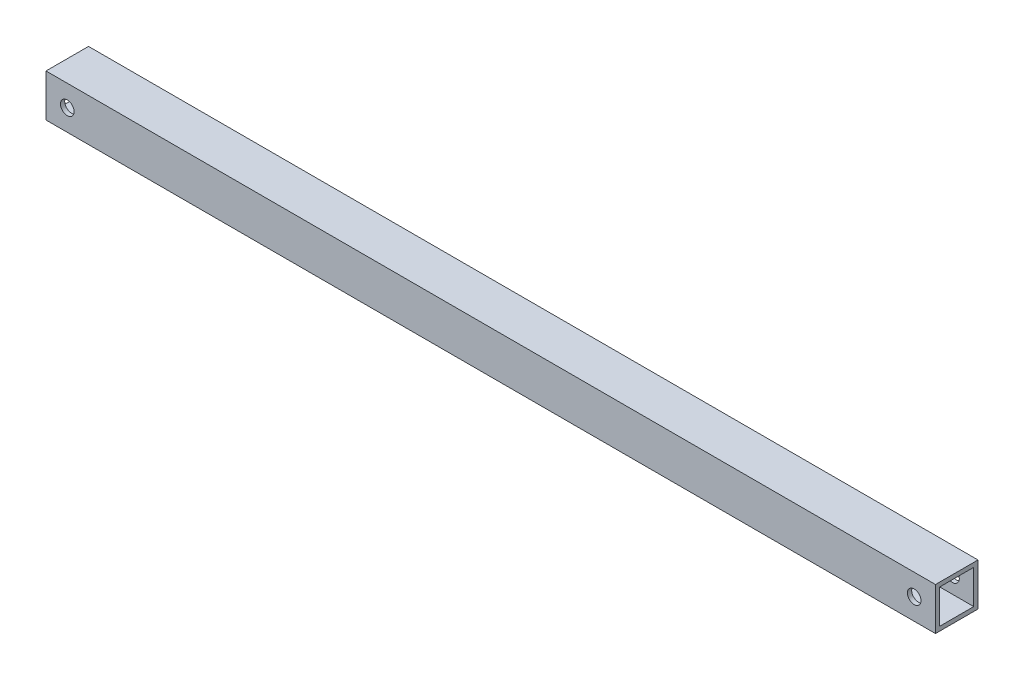
ISO-10303-21;
HEADER;
FILE_DESCRIPTION(('STEP AP214'),'2;1');
FILE_NAME('part.step','',(''),(''),'','','');
FILE_SCHEMA(('AUTOMOTIVE_DESIGN { 1 0 10303 214 1 1 1 1 }'));
ENDSEC;
DATA;
#1=APPLICATION_CONTEXT('core data for automotive mechanical design processes');
#2=APPLICATION_PROTOCOL_DEFINITION('international standard','automotive_design',2000,#1);
#3=PRODUCT_CONTEXT('',#1,'mechanical');
#4=PRODUCT('Part','Part','',(#3));
#5=PRODUCT_RELATED_PRODUCT_CATEGORY('part','',(#4));
#6=PRODUCT_DEFINITION_FORMATION('','',#4);
#7=PRODUCT_DEFINITION_CONTEXT('part definition',#1,'design');
#8=PRODUCT_DEFINITION('design','',#6,#7);
#9=PRODUCT_DEFINITION_SHAPE('','',#8);
#10=(LENGTH_UNIT() NAMED_UNIT(*) SI_UNIT(.MILLI.,.METRE.));
#11=(NAMED_UNIT(*) PLANE_ANGLE_UNIT() SI_UNIT($,.RADIAN.));
#12=(NAMED_UNIT(*) SI_UNIT($,.STERADIAN.) SOLID_ANGLE_UNIT());
#13=UNCERTAINTY_MEASURE_WITH_UNIT(LENGTH_MEASURE(1.E-05),#10,'distance_accuracy_value','');
#14=(GEOMETRIC_REPRESENTATION_CONTEXT(3) GLOBAL_UNCERTAINTY_ASSIGNED_CONTEXT((#13)) GLOBAL_UNIT_ASSIGNED_CONTEXT((#10,
#11,#12)) REPRESENTATION_CONTEXT('',''));
#15=CARTESIAN_POINT('',(0.,0.,0.));
#16=DIRECTION('',(0.,0.,1.));
#17=DIRECTION('',(1.,0.,0.));
#18=AXIS2_PLACEMENT_3D('',#15,#16,#17);
#19=CARTESIAN_POINT('',(-368.108891324554,245.000000000002,10.));
#20=DIRECTION('',(0.,0.,-1.));
#21=DIRECTION('',(-1.,0.,0.));
#22=AXIS2_PLACEMENT_3D('',#19,#20,#21);
#23=CYLINDRICAL_SURFACE('',#22,1.59999999999996);
#24=CARTESIAN_POINT('',(-368.108891324554,245.000000000002,0.999999999999999));
#25=DIRECTION('',(0.,0.,-1.));
#26=DIRECTION('',(-1.,0.,0.));
#27=AXIS2_PLACEMENT_3D('',#24,#25,#26);
#28=CIRCLE('',#27,1.59999999999996);
#29=CARTESIAN_POINT('',(-369.708891324554,245.000000000002,0.999999999999999));
#30=VERTEX_POINT('',#29);
#31=EDGE_CURVE('E139',#30,#30,#28,.T.);
#32=ORIENTED_EDGE('',*,*,#31,.F.);
#33=EDGE_LOOP('',(#32));
#34=FACE_BOUND('',#33,.T.);
#35=CARTESIAN_POINT('',(-368.108891324554,245.000000000002,0.));
#36=DIRECTION('',(0.,0.,1.));
#37=DIRECTION('',(1.,0.,0.));
#38=AXIS2_PLACEMENT_3D('',#35,#36,#37);
#39=CIRCLE('',#38,1.59999999999996);
#40=CARTESIAN_POINT('',(-366.508891324554,245.000000000002,0.));
#41=VERTEX_POINT('',#40);
#42=EDGE_CURVE('E146',#41,#41,#39,.T.);
#43=ORIENTED_EDGE('',*,*,#42,.F.);
#44=EDGE_LOOP('',(#43));
#45=FACE_BOUND('',#44,.T.);
#46=ADVANCED_FACE('F33',(#34,#45),#23,.F.);
#47=CARTESIAN_POINT('',(-567.294734199927,244.999999997917,10.));
#48=DIRECTION('',(0.,0.,-1.));
#49=DIRECTION('',(-1.,0.,0.));
#50=AXIS2_PLACEMENT_3D('',#47,#48,#49);
#51=CYLINDRICAL_SURFACE('',#50,1.60000000000002);
#52=CARTESIAN_POINT('',(-567.294734199927,244.999999997917,0.999999999999999));
#53=DIRECTION('',(0.,0.,-1.));
#54=DIRECTION('',(-1.,0.,0.));
#55=AXIS2_PLACEMENT_3D('',#52,#53,#54);
#56=CIRCLE('',#55,1.60000000000002);
#57=CARTESIAN_POINT('',(-568.894734199927,244.999999997917,0.999999999999999));
#58=VERTEX_POINT('',#57);
#59=EDGE_CURVE('E37',#58,#58,#56,.T.);
#60=ORIENTED_EDGE('',*,*,#59,.F.);
#61=EDGE_LOOP('',(#60));
#62=FACE_BOUND('',#61,.T.);
#63=CARTESIAN_POINT('',(-567.294734199927,244.999999997917,0.));
#64=DIRECTION('',(0.,0.,1.));
#65=DIRECTION('',(1.,0.,0.));
#66=AXIS2_PLACEMENT_3D('',#63,#64,#65);
#67=CIRCLE('',#66,1.60000000000002);
#68=CARTESIAN_POINT('',(-565.694734199927,244.999999997917,0.));
#69=VERTEX_POINT('',#68);
#70=EDGE_CURVE('E142',#69,#69,#67,.T.);
#71=ORIENTED_EDGE('',*,*,#70,.F.);
#72=EDGE_LOOP('',(#71));
#73=FACE_BOUND('',#72,.T.);
#74=ADVANCED_FACE('F189',(#62,#73),#51,.F.);
#75=CARTESIAN_POINT('',(0.,0.,10.));
#76=DIRECTION('',(0.,0.,1.));
#77=DIRECTION('',(1.,0.,0.));
#78=AXIS2_PLACEMENT_3D('',#75,#76,#77);
#79=PLANE('',#78);
#80=CARTESIAN_POINT('',(-368.108891324554,245.000000000002,10.));
#81=DIRECTION('',(0.,0.,1.));
#82=DIRECTION('',(1.,0.,0.));
#83=AXIS2_PLACEMENT_3D('',#80,#81,#82);
#84=CIRCLE('',#83,1.59999999999996);
#85=CARTESIAN_POINT('',(-366.508891324554,245.000000000002,10.));
#86=VERTEX_POINT('',#85);
#87=EDGE_CURVE('E149',#86,#86,#84,.T.);
#88=ORIENTED_EDGE('',*,*,#87,.F.);
#89=EDGE_LOOP('',(#88));
#90=FACE_BOUND('',#89,.T.);
#91=DIRECTION('',(0.,1.,0.));
#92=VECTOR('',#91,1.);
#93=CARTESIAN_POINT('',(-363.108891324554,240.000000000002,10.));
#94=LINE('',#93,#92);
#95=CARTESIAN_POINT('',(-363.108891324554,240.000000000002,10.));
#96=VERTEX_POINT('',#95);
#97=CARTESIAN_POINT('',(-363.108891324554,250.000000000002,10.));
#98=VERTEX_POINT('',#97);
#99=EDGE_CURVE('E155',#96,#98,#94,.T.);
#100=ORIENTED_EDGE('',*,*,#99,.T.);
#101=DIRECTION('',(-1.,0.,0.));
#102=VECTOR('',#101,1.);
#103=CARTESIAN_POINT('',(-363.108891324554,250.000000000002,10.));
#104=LINE('',#103,#102);
#105=CARTESIAN_POINT('',(-572.29473420006,250.000000000002,10.));
#106=VERTEX_POINT('',#105);
#107=EDGE_CURVE('E158',#98,#106,#104,.T.);
#108=ORIENTED_EDGE('',*,*,#107,.T.);
#109=DIRECTION('',(0.,-1.,0.));
#110=VECTOR('',#109,1.);
#111=CARTESIAN_POINT('',(-572.29473420006,240.000000000002,10.));
#112=LINE('',#111,#110);
#113=CARTESIAN_POINT('',(-572.29473420006,240.000000000002,10.));
#114=VERTEX_POINT('',#113);
#115=EDGE_CURVE('E161',#106,#114,#112,.T.);
#116=ORIENTED_EDGE('',*,*,#115,.T.);
#117=DIRECTION('',(1.,0.,0.));
#118=VECTOR('',#117,1.);
#119=CARTESIAN_POINT('',(-363.108891324554,240.000000000002,10.));
#120=LINE('',#119,#118);
#121=EDGE_CURVE('E163',#114,#96,#120,.T.);
#122=ORIENTED_EDGE('',*,*,#121,.T.);
#123=EDGE_LOOP('',(#100,#108,#116,#122));
#124=FACE_BOUND('',#123,.T.);
#125=CARTESIAN_POINT('',(-567.294734199927,244.999999997917,10.));
#126=DIRECTION('',(0.,0.,1.));
#127=DIRECTION('',(1.,0.,0.));
#128=AXIS2_PLACEMENT_3D('',#125,#126,#127);
#129=CIRCLE('',#128,1.60000000000002);
#130=CARTESIAN_POINT('',(-565.694734199927,244.999999997917,10.));
#131=VERTEX_POINT('',#130);
#132=EDGE_CURVE('E143',#131,#131,#129,.T.);
#133=ORIENTED_EDGE('',*,*,#132,.F.);
#134=EDGE_LOOP('',(#133));
#135=FACE_BOUND('',#134,.T.);
#136=ADVANCED_FACE('F192',(#90,#124,#135),#79,.T.);
#137=CARTESIAN_POINT('',(0.,0.,0.));
#138=DIRECTION('',(0.,0.,1.));
#139=DIRECTION('',(1.,0.,0.));
#140=AXIS2_PLACEMENT_3D('',#137,#138,#139);
#141=PLANE('',#140);
#142=DIRECTION('',(0.,1.,0.));
#143=VECTOR('',#142,1.);
#144=CARTESIAN_POINT('',(-363.108891324554,240.000000000002,0.));
#145=LINE('',#144,#143);
#146=CARTESIAN_POINT('',(-363.108891324554,240.000000000002,0.));
#147=VERTEX_POINT('',#146);
#148=CARTESIAN_POINT('',(-363.108891324554,250.000000000002,0.));
#149=VERTEX_POINT('',#148);
#150=EDGE_CURVE('E152',#147,#149,#145,.T.);
#151=ORIENTED_EDGE('',*,*,#150,.F.);
#152=DIRECTION('',(1.,0.,0.));
#153=VECTOR('',#152,1.);
#154=CARTESIAN_POINT('',(-363.108891324554,240.000000000002,0.));
#155=LINE('',#154,#153);
#156=CARTESIAN_POINT('',(-572.29473420006,240.000000000002,0.));
#157=VERTEX_POINT('',#156);
#158=EDGE_CURVE('E159',#157,#147,#155,.T.);
#159=ORIENTED_EDGE('',*,*,#158,.F.);
#160=DIRECTION('',(0.,-1.,0.));
#161=VECTOR('',#160,1.);
#162=CARTESIAN_POINT('',(-572.29473420006,240.000000000002,0.));
#163=LINE('',#162,#161);
#164=CARTESIAN_POINT('',(-572.29473420006,250.000000000002,0.));
#165=VERTEX_POINT('',#164);
#166=EDGE_CURVE('E170',#165,#157,#163,.T.);
#167=ORIENTED_EDGE('',*,*,#166,.F.);
#168=DIRECTION('',(-1.,0.,0.));
#169=VECTOR('',#168,1.);
#170=CARTESIAN_POINT('',(-363.108891324554,250.000000000002,0.));
#171=LINE('',#170,#169);
#172=EDGE_CURVE('E168',#149,#165,#171,.T.);
#173=ORIENTED_EDGE('',*,*,#172,.F.);
#174=EDGE_LOOP('',(#151,#159,#167,#173));
#175=FACE_BOUND('',#174,.T.);
#176=ORIENTED_EDGE('',*,*,#42,.T.);
#177=EDGE_LOOP('',(#176));
#178=FACE_BOUND('',#177,.T.);
#179=ORIENTED_EDGE('',*,*,#70,.T.);
#180=EDGE_LOOP('',(#179));
#181=FACE_BOUND('',#180,.T.);
#182=ADVANCED_FACE('F194',(#175,#178,#181),#141,.F.);
#183=CARTESIAN_POINT('',(-363.108891324554,240.000000000002,10.));
#184=DIRECTION('',(-1.,0.,0.));
#185=DIRECTION('',(0.,0.,1.));
#186=AXIS2_PLACEMENT_3D('',#183,#184,#185);
#187=PLANE('',#186);
#188=DIRECTION('',(0.,0.,-1.));
#189=VECTOR('',#188,1.);
#190=CARTESIAN_POINT('',(-363.108891324554,249.000000000002,1.));
#191=LINE('',#190,#189);
#192=CARTESIAN_POINT('',(-363.108891324554,249.000000000002,9.));
#193=VERTEX_POINT('',#192);
#194=CARTESIAN_POINT('',(-363.108891324554,249.000000000002,1.));
#195=VERTEX_POINT('',#194);
#196=EDGE_CURVE('E108',#193,#195,#191,.T.);
#197=ORIENTED_EDGE('',*,*,#196,.T.);
#198=DIRECTION('',(0.,-1.,0.));
#199=VECTOR('',#198,1.);
#200=CARTESIAN_POINT('',(-363.108891324554,241.000000000002,1.));
#201=LINE('',#200,#199);
#202=CARTESIAN_POINT('',(-363.108891324554,241.000000000002,1.));
#203=VERTEX_POINT('',#202);
#204=EDGE_CURVE('E102',#195,#203,#201,.T.);
#205=ORIENTED_EDGE('',*,*,#204,.T.);
#206=DIRECTION('',(0.,0.,1.));
#207=VECTOR('',#206,1.);
#208=CARTESIAN_POINT('',(-363.108891324554,241.000000000002,1.));
#209=LINE('',#208,#207);
#210=CARTESIAN_POINT('',(-363.108891324554,241.000000000002,9.));
#211=VERTEX_POINT('',#210);
#212=EDGE_CURVE('E111',#203,#211,#209,.T.);
#213=ORIENTED_EDGE('',*,*,#212,.T.);
#214=DIRECTION('',(0.,1.,0.));
#215=VECTOR('',#214,1.);
#216=CARTESIAN_POINT('',(-363.108891324554,241.000000000002,9.));
#217=LINE('',#216,#215);
#218=EDGE_CURVE('E50',#211,#193,#217,.T.);
#219=ORIENTED_EDGE('',*,*,#218,.T.);
#220=EDGE_LOOP('',(#197,#205,#213,#219));
#221=FACE_BOUND('',#220,.T.);
#222=ORIENTED_EDGE('',*,*,#150,.T.);
#223=DIRECTION('',(0.,0.,-1.));
#224=VECTOR('',#223,1.);
#225=CARTESIAN_POINT('',(-363.108891324554,250.000000000002,10.));
#226=LINE('',#225,#224);
#227=EDGE_CURVE('E11',#98,#149,#226,.T.);
#228=ORIENTED_EDGE('',*,*,#227,.F.);
#229=ORIENTED_EDGE('',*,*,#99,.F.);
#230=DIRECTION('',(0.,0.,-1.));
#231=VECTOR('',#230,1.);
#232=CARTESIAN_POINT('',(-363.108891324554,240.000000000002,10.));
#233=LINE('',#232,#231);
#234=EDGE_CURVE('E165',#96,#147,#233,.T.);
#235=ORIENTED_EDGE('',*,*,#234,.T.);
#236=EDGE_LOOP('',(#222,#228,#229,#235));
#237=FACE_BOUND('',#236,.T.);
#238=ADVANCED_FACE('F35',(#221,#237),#187,.F.);
#239=CARTESIAN_POINT('',(-363.108891324554,250.000000000002,10.));
#240=DIRECTION('',(0.,-1.,0.));
#241=DIRECTION('',(0.,0.,-1.));
#242=AXIS2_PLACEMENT_3D('',#239,#240,#241);
#243=PLANE('',#242);
#244=ORIENTED_EDGE('',*,*,#172,.T.);
#245=DIRECTION('',(0.,0.,-1.));
#246=VECTOR('',#245,1.);
#247=CARTESIAN_POINT('',(-572.29473420006,250.000000000002,10.));
#248=LINE('',#247,#246);
#249=EDGE_CURVE('E42',#106,#165,#248,.T.);
#250=ORIENTED_EDGE('',*,*,#249,.F.);
#251=ORIENTED_EDGE('',*,*,#107,.F.);
#252=ORIENTED_EDGE('',*,*,#227,.T.);
#253=EDGE_LOOP('',(#244,#250,#251,#252));
#254=FACE_BOUND('',#253,.T.);
#255=ADVANCED_FACE('F298',(#254),#243,.F.);
#256=CARTESIAN_POINT('',(-572.29473420006,240.000000000002,10.));
#257=DIRECTION('',(1.,0.,0.));
#258=DIRECTION('',(0.,0.,-1.));
#259=AXIS2_PLACEMENT_3D('',#256,#257,#258);
#260=PLANE('',#259);
#261=DIRECTION('',(0.,0.,1.));
#262=VECTOR('',#261,1.);
#263=CARTESIAN_POINT('',(-572.29473420006,241.000000000002,1.));
#264=LINE('',#263,#262);
#265=CARTESIAN_POINT('',(-572.29473420006,241.000000000002,0.999999999999999));
#266=VERTEX_POINT('',#265);
#267=CARTESIAN_POINT('',(-572.29473420006,241.000000000002,9.));
#268=VERTEX_POINT('',#267);
#269=EDGE_CURVE('E126',#266,#268,#264,.T.);
#270=ORIENTED_EDGE('',*,*,#269,.F.);
#271=DIRECTION('',(0.,-1.,0.));
#272=VECTOR('',#271,1.);
#273=CARTESIAN_POINT('',(-572.29473420006,241.000000000002,1.));
#274=LINE('',#273,#272);
#275=CARTESIAN_POINT('',(-572.29473420006,249.000000000002,1.));
#276=VERTEX_POINT('',#275);
#277=EDGE_CURVE('E58',#276,#266,#274,.T.);
#278=ORIENTED_EDGE('',*,*,#277,.F.);
#279=DIRECTION('',(0.,0.,-1.));
#280=VECTOR('',#279,1.);
#281=CARTESIAN_POINT('',(-572.29473420006,249.000000000002,1.));
#282=LINE('',#281,#280);
#283=CARTESIAN_POINT('',(-572.29473420006,249.000000000002,9.));
#284=VERTEX_POINT('',#283);
#285=EDGE_CURVE('E117',#284,#276,#282,.T.);
#286=ORIENTED_EDGE('',*,*,#285,.F.);
#287=DIRECTION('',(0.,1.,0.));
#288=VECTOR('',#287,1.);
#289=CARTESIAN_POINT('',(-572.29473420006,241.000000000002,9.));
#290=LINE('',#289,#288);
#291=EDGE_CURVE('E120',#268,#284,#290,.T.);
#292=ORIENTED_EDGE('',*,*,#291,.F.);
#293=EDGE_LOOP('',(#270,#278,#286,#292));
#294=FACE_BOUND('',#293,.T.);
#295=ORIENTED_EDGE('',*,*,#166,.T.);
#296=DIRECTION('',(0.,0.,-1.));
#297=VECTOR('',#296,1.);
#298=CARTESIAN_POINT('',(-572.29473420006,240.000000000002,10.));
#299=LINE('',#298,#297);
#300=EDGE_CURVE('E175',#114,#157,#299,.T.);
#301=ORIENTED_EDGE('',*,*,#300,.F.);
#302=ORIENTED_EDGE('',*,*,#115,.F.);
#303=ORIENTED_EDGE('',*,*,#249,.T.);
#304=EDGE_LOOP('',(#295,#301,#302,#303));
#305=FACE_BOUND('',#304,.T.);
#306=ADVANCED_FACE('F219',(#294,#305),#260,.F.);
#307=CARTESIAN_POINT('',(-363.108891324554,240.000000000002,10.));
#308=DIRECTION('',(0.,1.,0.));
#309=DIRECTION('',(-1.,0.,0.));
#310=AXIS2_PLACEMENT_3D('',#307,#308,#309);
#311=PLANE('',#310);
#312=ORIENTED_EDGE('',*,*,#158,.T.);
#313=ORIENTED_EDGE('',*,*,#234,.F.);
#314=ORIENTED_EDGE('',*,*,#121,.F.);
#315=ORIENTED_EDGE('',*,*,#300,.T.);
#316=EDGE_LOOP('',(#312,#313,#314,#315));
#317=FACE_BOUND('',#316,.T.);
#318=ADVANCED_FACE('F214',(#317),#311,.F.);
#319=CARTESIAN_POINT('',(-368.108891324554,245.000000000002,9.));
#320=DIRECTION('',(0.,0.,1.));
#321=DIRECTION('',(1.,0.,0.));
#322=AXIS2_PLACEMENT_3D('',#319,#320,#321);
#323=CIRCLE('',#322,1.59999999999996);
#324=CARTESIAN_POINT('',(-366.508891324554,245.000000000002,9.));
#325=VERTEX_POINT('',#324);
#326=EDGE_CURVE('E136',#325,#325,#323,.T.);
#327=ORIENTED_EDGE('',*,*,#326,.F.);
#328=EDGE_LOOP('',(#327));
#329=FACE_BOUND('',#328,.T.);
#330=ORIENTED_EDGE('',*,*,#87,.T.);
#331=EDGE_LOOP('',(#330));
#332=FACE_BOUND('',#331,.T.);
#333=ADVANCED_FACE('F187',(#329,#332),#23,.F.);
#334=CARTESIAN_POINT('',(-567.294734199927,244.999999997917,9.));
#335=DIRECTION('',(0.,0.,1.));
#336=DIRECTION('',(1.,0.,0.));
#337=AXIS2_PLACEMENT_3D('',#334,#335,#336);
#338=CIRCLE('',#337,1.60000000000002);
#339=CARTESIAN_POINT('',(-565.694734199927,244.999999997917,9.));
#340=VERTEX_POINT('',#339);
#341=EDGE_CURVE('E132',#340,#340,#338,.T.);
#342=ORIENTED_EDGE('',*,*,#341,.F.);
#343=EDGE_LOOP('',(#342));
#344=FACE_BOUND('',#343,.T.);
#345=ORIENTED_EDGE('',*,*,#132,.T.);
#346=EDGE_LOOP('',(#345));
#347=FACE_BOUND('',#346,.T.);
#348=ADVANCED_FACE('F184',(#344,#347),#51,.F.);
#349=CARTESIAN_POINT('',(-363.108891324554,241.000000000002,1.));
#350=DIRECTION('',(0.,0.,-1.));
#351=DIRECTION('',(-1.,0.,0.));
#352=AXIS2_PLACEMENT_3D('',#349,#350,#351);
#353=PLANE('',#352);
#354=ORIENTED_EDGE('',*,*,#31,.T.);
#355=EDGE_LOOP('',(#354));
#356=FACE_BOUND('',#355,.T.);
#357=ORIENTED_EDGE('',*,*,#59,.T.);
#358=EDGE_LOOP('',(#357));
#359=FACE_BOUND('',#358,.T.);
#360=ORIENTED_EDGE('',*,*,#277,.T.);
#361=DIRECTION('',(-1.,0.,0.));
#362=VECTOR('',#361,1.);
#363=CARTESIAN_POINT('',(-363.108891324554,241.000000000002,1.));
#364=LINE('',#363,#362);
#365=EDGE_CURVE('E98',#203,#266,#364,.T.);
#366=ORIENTED_EDGE('',*,*,#365,.F.);
#367=ORIENTED_EDGE('',*,*,#204,.F.);
#368=DIRECTION('',(-1.,0.,0.));
#369=VECTOR('',#368,1.);
#370=CARTESIAN_POINT('',(-363.108891324554,249.000000000002,1.));
#371=LINE('',#370,#369);
#372=EDGE_CURVE('E130',#195,#276,#371,.T.);
#373=ORIENTED_EDGE('',*,*,#372,.T.);
#374=EDGE_LOOP('',(#360,#366,#367,#373));
#375=FACE_BOUND('',#374,.T.);
#376=ADVANCED_FACE('F100',(#356,#359,#375),#353,.F.);
#377=CARTESIAN_POINT('',(-363.108891324554,249.000000000002,1.));
#378=DIRECTION('',(0.,1.,0.));
#379=DIRECTION('',(0.,0.,1.));
#380=AXIS2_PLACEMENT_3D('',#377,#378,#379);
#381=PLANE('',#380);
#382=ORIENTED_EDGE('',*,*,#285,.T.);
#383=ORIENTED_EDGE('',*,*,#372,.F.);
#384=ORIENTED_EDGE('',*,*,#196,.F.);
#385=DIRECTION('',(-1.,0.,0.));
#386=VECTOR('',#385,1.);
#387=CARTESIAN_POINT('',(-363.108891324554,249.000000000002,9.));
#388=LINE('',#387,#386);
#389=EDGE_CURVE('E133',#193,#284,#388,.T.);
#390=ORIENTED_EDGE('',*,*,#389,.T.);
#391=EDGE_LOOP('',(#382,#383,#384,#390));
#392=FACE_BOUND('',#391,.T.);
#393=ADVANCED_FACE('F226',(#392),#381,.F.);
#394=CARTESIAN_POINT('',(-363.108891324554,241.000000000002,9.));
#395=DIRECTION('',(0.,0.,1.));
#396=DIRECTION('',(1.,0.,0.));
#397=AXIS2_PLACEMENT_3D('',#394,#395,#396);
#398=PLANE('',#397);
#399=ORIENTED_EDGE('',*,*,#326,.T.);
#400=EDGE_LOOP('',(#399));
#401=FACE_BOUND('',#400,.T.);
#402=ORIENTED_EDGE('',*,*,#341,.T.);
#403=EDGE_LOOP('',(#402));
#404=FACE_BOUND('',#403,.T.);
#405=ORIENTED_EDGE('',*,*,#291,.T.);
#406=ORIENTED_EDGE('',*,*,#389,.F.);
#407=ORIENTED_EDGE('',*,*,#218,.F.);
#408=DIRECTION('',(-1.,0.,0.));
#409=VECTOR('',#408,1.);
#410=CARTESIAN_POINT('',(-363.108891324554,241.000000000002,9.));
#411=LINE('',#410,#409);
#412=EDGE_CURVE('E107',#211,#268,#411,.T.);
#413=ORIENTED_EDGE('',*,*,#412,.T.);
#414=EDGE_LOOP('',(#405,#406,#407,#413));
#415=FACE_BOUND('',#414,.T.);
#416=ADVANCED_FACE('F182',(#401,#404,#415),#398,.F.);
#417=CARTESIAN_POINT('',(-363.108891324554,241.000000000002,1.));
#418=DIRECTION('',(0.,-1.,0.));
#419=DIRECTION('',(0.,0.,-1.));
#420=AXIS2_PLACEMENT_3D('',#417,#418,#419);
#421=PLANE('',#420);
#422=ORIENTED_EDGE('',*,*,#269,.T.);
#423=ORIENTED_EDGE('',*,*,#412,.F.);
#424=ORIENTED_EDGE('',*,*,#212,.F.);
#425=ORIENTED_EDGE('',*,*,#365,.T.);
#426=EDGE_LOOP('',(#422,#423,#424,#425));
#427=FACE_BOUND('',#426,.T.);
#428=ADVANCED_FACE('F112',(#427),#421,.F.);
#429=CLOSED_SHELL('',(#46,#74,#136,#182,#238,#255,#306,#318,#333,#348,#376,#393,#416,#428));
#430=MANIFOLD_SOLID_BREP('B2',#429);
#431=ADVANCED_BREP_SHAPE_REPRESENTATION('',(#18,#430),#14);
#432=SHAPE_DEFINITION_REPRESENTATION(#9,#431);
ENDSEC;
END-ISO-10303-21;
